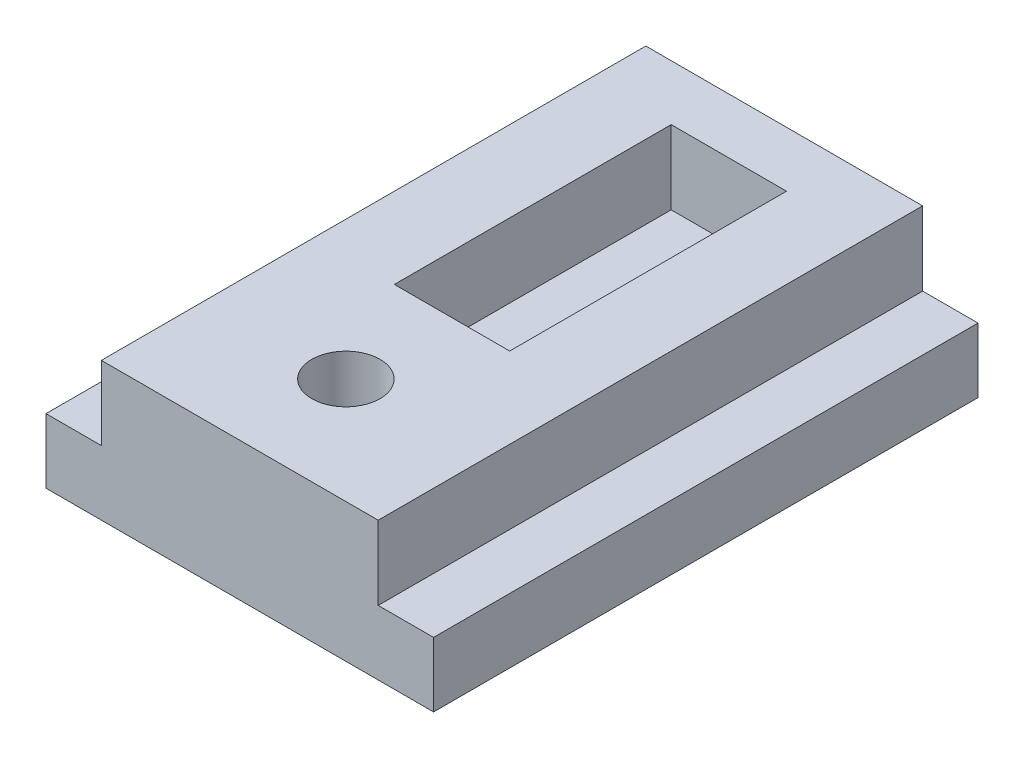
ISO-10303-21;
HEADER;
FILE_DESCRIPTION(('STEP AP214'),'2;1');
FILE_NAME('part.step','',(''),(''),'','','');
FILE_SCHEMA(('AUTOMOTIVE_DESIGN { 1 0 10303 214 1 1 1 1 }'));
ENDSEC;
DATA;
#1=APPLICATION_CONTEXT('core data for automotive mechanical design processes');
#2=APPLICATION_PROTOCOL_DEFINITION('international standard','automotive_design',2000,#1);
#3=PRODUCT_CONTEXT('',#1,'mechanical');
#4=PRODUCT('Part','Part','',(#3));
#5=PRODUCT_RELATED_PRODUCT_CATEGORY('part','',(#4));
#6=PRODUCT_DEFINITION_FORMATION('','',#4);
#7=PRODUCT_DEFINITION_CONTEXT('part definition',#1,'design');
#8=PRODUCT_DEFINITION('design','',#6,#7);
#9=PRODUCT_DEFINITION_SHAPE('','',#8);
#10=(LENGTH_UNIT() NAMED_UNIT(*) SI_UNIT(.MILLI.,.METRE.));
#11=(NAMED_UNIT(*) PLANE_ANGLE_UNIT() SI_UNIT($,.RADIAN.));
#12=(NAMED_UNIT(*) SI_UNIT($,.STERADIAN.) SOLID_ANGLE_UNIT());
#13=UNCERTAINTY_MEASURE_WITH_UNIT(LENGTH_MEASURE(1.E-05),#10,'distance_accuracy_value','');
#14=(GEOMETRIC_REPRESENTATION_CONTEXT(3) GLOBAL_UNCERTAINTY_ASSIGNED_CONTEXT((#13)) GLOBAL_UNIT_ASSIGNED_CONTEXT((#10,
#11,#12)) REPRESENTATION_CONTEXT('',''));
#15=CARTESIAN_POINT('',(0.,0.,0.));
#16=DIRECTION('',(0.,0.,1.));
#17=DIRECTION('',(1.,0.,0.));
#18=AXIS2_PLACEMENT_3D('',#15,#16,#17);
#19=CARTESIAN_POINT('',(7.5,-0.249999999999998,14.75));
#20=DIRECTION('',(-1.,0.,0.));
#21=DIRECTION('',(0.,-1.,0.));
#22=AXIS2_PLACEMENT_3D('',#19,#20,#21);
#23=PLANE('',#22);
#24=DIRECTION('',(0.,1.,0.));
#25=VECTOR('',#24,1.);
#26=CARTESIAN_POINT('',(7.5,-0.249999999999998,-14.75));
#27=LINE('',#26,#25);
#28=CARTESIAN_POINT('',(7.5,-0.249999999999998,-14.75));
#29=VERTEX_POINT('',#28);
#30=CARTESIAN_POINT('',(7.5,3.75,-14.75));
#31=VERTEX_POINT('',#30);
#32=EDGE_CURVE('E144',#29,#31,#27,.T.);
#33=ORIENTED_EDGE('',*,*,#32,.T.);
#34=DIRECTION('',(0.,0.,-1.));
#35=VECTOR('',#34,1.);
#36=CARTESIAN_POINT('',(7.5,3.75,14.75));
#37=LINE('',#36,#35);
#38=CARTESIAN_POINT('',(7.5,3.75,14.75));
#39=VERTEX_POINT('',#38);
#40=EDGE_CURVE('E11',#39,#31,#37,.T.);
#41=ORIENTED_EDGE('',*,*,#40,.F.);
#42=DIRECTION('',(0.,1.,0.));
#43=VECTOR('',#42,1.);
#44=CARTESIAN_POINT('',(7.5,-0.249999999999998,14.75));
#45=LINE('',#44,#43);
#46=CARTESIAN_POINT('',(7.5,-0.249999999999998,14.75));
#47=VERTEX_POINT('',#46);
#48=EDGE_CURVE('E160',#47,#39,#45,.T.);
#49=ORIENTED_EDGE('',*,*,#48,.F.);
#50=DIRECTION('',(0.,0.,-1.));
#51=VECTOR('',#50,1.);
#52=CARTESIAN_POINT('',(7.5,-0.249999999999998,14.75));
#53=LINE('',#52,#51);
#54=EDGE_CURVE('E140',#47,#29,#53,.T.);
#55=ORIENTED_EDGE('',*,*,#54,.T.);
#56=EDGE_LOOP('',(#33,#41,#49,#55));
#57=FACE_BOUND('',#56,.T.);
#58=ADVANCED_FACE('F36',(#57),#23,.F.);
#59=CARTESIAN_POINT('',(-7.5,3.75,14.75));
#60=DIRECTION('',(0.,-1.,0.));
#61=DIRECTION('',(1.,0.,0.));
#62=AXIS2_PLACEMENT_3D('',#59,#60,#61);
#63=PLANE('',#62);
#64=CARTESIAN_POINT('',(0.,3.75,9.));
#65=DIRECTION('',(0.,1.,0.));
#66=DIRECTION('',(0.,0.,1.));
#67=AXIS2_PLACEMENT_3D('',#64,#65,#66);
#68=CIRCLE('',#67,1.85);
#69=CARTESIAN_POINT('',(0.,3.75,10.85));
#70=VERTEX_POINT('',#69);
#71=EDGE_CURVE('E228',#70,#70,#68,.T.);
#72=ORIENTED_EDGE('',*,*,#71,.F.);
#73=EDGE_LOOP('',(#72));
#74=FACE_BOUND('',#73,.T.);
#75=DIRECTION('',(0.,0.,-1.));
#76=VECTOR('',#75,1.);
#77=CARTESIAN_POINT('',(3.125,3.75,3.25));
#78=LINE('',#77,#76);
#79=CARTESIAN_POINT('',(3.125,3.75,3.25));
#80=VERTEX_POINT('',#79);
#81=CARTESIAN_POINT('',(3.125,3.75,-11.75));
#82=VERTEX_POINT('',#81);
#83=EDGE_CURVE('E148',#80,#82,#78,.T.);
#84=ORIENTED_EDGE('',*,*,#83,.F.);
#85=DIRECTION('',(1.,0.,0.));
#86=VECTOR('',#85,1.);
#87=CARTESIAN_POINT('',(3.125,3.75,3.25));
#88=LINE('',#87,#86);
#89=CARTESIAN_POINT('',(-3.125,3.75,3.25));
#90=VERTEX_POINT('',#89);
#91=EDGE_CURVE('E197',#90,#80,#88,.T.);
#92=ORIENTED_EDGE('',*,*,#91,.F.);
#93=DIRECTION('',(0.,0.,-1.));
#94=VECTOR('',#93,1.);
#95=CARTESIAN_POINT('',(-3.125,3.75,3.25));
#96=LINE('',#95,#94);
#97=CARTESIAN_POINT('',(-3.125,3.75,-11.75));
#98=VERTEX_POINT('',#97);
#99=EDGE_CURVE('E200',#90,#98,#96,.T.);
#100=ORIENTED_EDGE('',*,*,#99,.T.);
#101=DIRECTION('',(1.,0.,0.));
#102=VECTOR('',#101,1.);
#103=CARTESIAN_POINT('',(3.125,3.75,-11.75));
#104=LINE('',#103,#102);
#105=EDGE_CURVE('E204',#98,#82,#104,.T.);
#106=ORIENTED_EDGE('',*,*,#105,.T.);
#107=EDGE_LOOP('',(#84,#92,#100,#106));
#108=FACE_BOUND('',#107,.T.);
#109=DIRECTION('',(-1.,0.,0.));
#110=VECTOR('',#109,1.);
#111=CARTESIAN_POINT('',(-7.5,3.75,-14.75));
#112=LINE('',#111,#110);
#113=CARTESIAN_POINT('',(-7.5,3.75,-14.75));
#114=VERTEX_POINT('',#113);
#115=EDGE_CURVE('E147',#31,#114,#112,.T.);
#116=ORIENTED_EDGE('',*,*,#115,.T.);
#117=DIRECTION('',(0.,0.,-1.));
#118=VECTOR('',#117,1.);
#119=CARTESIAN_POINT('',(-7.5,3.75,14.75));
#120=LINE('',#119,#118);
#121=CARTESIAN_POINT('',(-7.5,3.75,14.75));
#122=VERTEX_POINT('',#121);
#123=EDGE_CURVE('E43',#122,#114,#120,.T.);
#124=ORIENTED_EDGE('',*,*,#123,.F.);
#125=DIRECTION('',(-1.,0.,0.));
#126=VECTOR('',#125,1.);
#127=CARTESIAN_POINT('',(-7.5,3.75,14.75));
#128=LINE('',#127,#126);
#129=EDGE_CURVE('E100',#39,#122,#128,.T.);
#130=ORIENTED_EDGE('',*,*,#129,.F.);
#131=ORIENTED_EDGE('',*,*,#40,.T.);
#132=EDGE_LOOP('',(#116,#124,#130,#131));
#133=FACE_BOUND('',#132,.T.);
#134=ADVANCED_FACE('F234',(#74,#108,#133),#63,.F.);
#135=CARTESIAN_POINT('',(-7.5,-0.249999999999999,14.75));
#136=DIRECTION('',(1.,0.,0.));
#137=DIRECTION('',(0.,1.,0.));
#138=AXIS2_PLACEMENT_3D('',#135,#136,#137);
#139=PLANE('',#138);
#140=DIRECTION('',(0.,-1.,0.));
#141=VECTOR('',#140,1.);
#142=CARTESIAN_POINT('',(-7.5,-0.249999999999999,-14.75));
#143=LINE('',#142,#141);
#144=CARTESIAN_POINT('',(-7.5,-0.249999999999999,-14.75));
#145=VERTEX_POINT('',#144);
#146=EDGE_CURVE('E150',#114,#145,#143,.T.);
#147=ORIENTED_EDGE('',*,*,#146,.T.);
#148=DIRECTION('',(0.,0.,-1.));
#149=VECTOR('',#148,1.);
#150=CARTESIAN_POINT('',(-7.5,-0.249999999999999,14.75));
#151=LINE('',#150,#149);
#152=CARTESIAN_POINT('',(-7.5,-0.249999999999999,14.75));
#153=VERTEX_POINT('',#152);
#154=EDGE_CURVE('E167',#153,#145,#151,.T.);
#155=ORIENTED_EDGE('',*,*,#154,.F.);
#156=DIRECTION('',(0.,-1.,0.));
#157=VECTOR('',#156,1.);
#158=CARTESIAN_POINT('',(-7.5,-0.249999999999999,14.75));
#159=LINE('',#158,#157);
#160=EDGE_CURVE('E175',#122,#153,#159,.T.);
#161=ORIENTED_EDGE('',*,*,#160,.F.);
#162=ORIENTED_EDGE('',*,*,#123,.T.);
#163=EDGE_LOOP('',(#147,#155,#161,#162));
#164=FACE_BOUND('',#163,.T.);
#165=ADVANCED_FACE('F173',(#164),#139,.F.);
#166=CARTESIAN_POINT('',(-7.5,-0.249999999999999,14.75));
#167=DIRECTION('',(0.,-1.,0.));
#168=DIRECTION('',(1.,0.,0.));
#169=AXIS2_PLACEMENT_3D('',#166,#167,#168);
#170=PLANE('',#169);
#171=DIRECTION('',(-1.,0.,0.));
#172=VECTOR('',#171,1.);
#173=CARTESIAN_POINT('',(-7.5,-0.249999999999999,-14.75));
#174=LINE('',#173,#172);
#175=CARTESIAN_POINT('',(-10.5,-0.25,-14.75));
#176=VERTEX_POINT('',#175);
#177=EDGE_CURVE('E152',#145,#176,#174,.T.);
#178=ORIENTED_EDGE('',*,*,#177,.T.);
#179=DIRECTION('',(0.,0.,-1.));
#180=VECTOR('',#179,1.);
#181=CARTESIAN_POINT('',(-10.5,-0.25,14.75));
#182=LINE('',#181,#180);
#183=CARTESIAN_POINT('',(-10.5,-0.25,14.75));
#184=VERTEX_POINT('',#183);
#185=EDGE_CURVE('E164',#184,#176,#182,.T.);
#186=ORIENTED_EDGE('',*,*,#185,.F.);
#187=DIRECTION('',(-1.,0.,0.));
#188=VECTOR('',#187,1.);
#189=CARTESIAN_POINT('',(-7.5,-0.249999999999999,14.75));
#190=LINE('',#189,#188);
#191=EDGE_CURVE('E187',#153,#184,#190,.T.);
#192=ORIENTED_EDGE('',*,*,#191,.F.);
#193=ORIENTED_EDGE('',*,*,#154,.T.);
#194=EDGE_LOOP('',(#178,#186,#192,#193));
#195=FACE_BOUND('',#194,.T.);
#196=ADVANCED_FACE('F183',(#195),#170,.F.);
#197=CARTESIAN_POINT('',(-10.5,-3.75,14.75));
#198=DIRECTION('',(1.,0.,0.));
#199=DIRECTION('',(0.,1.,0.));
#200=AXIS2_PLACEMENT_3D('',#197,#198,#199);
#201=PLANE('',#200);
#202=DIRECTION('',(0.,-1.,0.));
#203=VECTOR('',#202,1.);
#204=CARTESIAN_POINT('',(-10.5,-3.75,-14.75));
#205=LINE('',#204,#203);
#206=CARTESIAN_POINT('',(-10.5,-3.75,-14.75));
#207=VERTEX_POINT('',#206);
#208=EDGE_CURVE('E154',#176,#207,#205,.T.);
#209=ORIENTED_EDGE('',*,*,#208,.T.);
#210=DIRECTION('',(0.,0.,-1.));
#211=VECTOR('',#210,1.);
#212=CARTESIAN_POINT('',(-10.5,-3.75,14.75));
#213=LINE('',#212,#211);
#214=CARTESIAN_POINT('',(-10.5,-3.75,14.75));
#215=VERTEX_POINT('',#214);
#216=EDGE_CURVE('E135',#215,#207,#213,.T.);
#217=ORIENTED_EDGE('',*,*,#216,.F.);
#218=DIRECTION('',(0.,-1.,0.));
#219=VECTOR('',#218,1.);
#220=CARTESIAN_POINT('',(-10.5,-3.75,14.75));
#221=LINE('',#220,#219);
#222=EDGE_CURVE('E123',#184,#215,#221,.T.);
#223=ORIENTED_EDGE('',*,*,#222,.F.);
#224=ORIENTED_EDGE('',*,*,#185,.T.);
#225=EDGE_LOOP('',(#209,#217,#223,#224));
#226=FACE_BOUND('',#225,.T.);
#227=ADVANCED_FACE('F186',(#226),#201,.F.);
#228=CARTESIAN_POINT('',(-10.5,-3.75,14.75));
#229=DIRECTION('',(0.,1.,0.));
#230=DIRECTION('',(-1.,0.,0.));
#231=AXIS2_PLACEMENT_3D('',#228,#229,#230);
#232=PLANE('',#231);
#233=CARTESIAN_POINT('',(0.,-3.75,9.));
#234=DIRECTION('',(0.,1.,0.));
#235=DIRECTION('',(-1.,0.,0.));
#236=AXIS2_PLACEMENT_3D('',#233,#234,#235);
#237=CIRCLE('',#236,1.85);
#238=CARTESIAN_POINT('',(-1.85,-3.75,9.));
#239=VERTEX_POINT('',#238);
#240=EDGE_CURVE('E215',#239,#239,#237,.T.);
#241=ORIENTED_EDGE('',*,*,#240,.T.);
#242=EDGE_LOOP('',(#241));
#243=FACE_BOUND('',#242,.T.);
#244=DIRECTION('',(1.,0.,0.));
#245=VECTOR('',#244,1.);
#246=CARTESIAN_POINT('',(-10.5,-3.75,-14.75));
#247=LINE('',#246,#245);
#248=CARTESIAN_POINT('',(10.5,-3.75,-14.75));
#249=VERTEX_POINT('',#248);
#250=EDGE_CURVE('E132',#207,#249,#247,.T.);
#251=ORIENTED_EDGE('',*,*,#250,.T.);
#252=DIRECTION('',(0.,0.,-1.));
#253=VECTOR('',#252,1.);
#254=CARTESIAN_POINT('',(10.5,-3.75,14.75));
#255=LINE('',#254,#253);
#256=CARTESIAN_POINT('',(10.5,-3.75,14.75));
#257=VERTEX_POINT('',#256);
#258=EDGE_CURVE('E129',#257,#249,#255,.T.);
#259=ORIENTED_EDGE('',*,*,#258,.F.);
#260=DIRECTION('',(1.,0.,0.));
#261=VECTOR('',#260,1.);
#262=CARTESIAN_POINT('',(-10.5,-3.75,14.75));
#263=LINE('',#262,#261);
#264=EDGE_CURVE('E116',#215,#257,#263,.T.);
#265=ORIENTED_EDGE('',*,*,#264,.F.);
#266=ORIENTED_EDGE('',*,*,#216,.T.);
#267=EDGE_LOOP('',(#251,#259,#265,#266));
#268=FACE_BOUND('',#267,.T.);
#269=ADVANCED_FACE('F130',(#243,#268),#232,.F.);
#270=CARTESIAN_POINT('',(10.5,-3.75,14.75));
#271=DIRECTION('',(-1.,0.,0.));
#272=DIRECTION('',(0.,-1.,0.));
#273=AXIS2_PLACEMENT_3D('',#270,#271,#272);
#274=PLANE('',#273);
#275=DIRECTION('',(0.,1.,0.));
#276=VECTOR('',#275,1.);
#277=CARTESIAN_POINT('',(10.5,-3.75,-14.75));
#278=LINE('',#277,#276);
#279=CARTESIAN_POINT('',(10.5,-0.249999999999997,-14.75));
#280=VERTEX_POINT('',#279);
#281=EDGE_CURVE('E157',#249,#280,#278,.T.);
#282=ORIENTED_EDGE('',*,*,#281,.T.);
#283=DIRECTION('',(0.,0.,-1.));
#284=VECTOR('',#283,1.);
#285=CARTESIAN_POINT('',(10.5,-0.249999999999997,14.75));
#286=LINE('',#285,#284);
#287=CARTESIAN_POINT('',(10.5,-0.249999999999997,14.75));
#288=VERTEX_POINT('',#287);
#289=EDGE_CURVE('E136',#288,#280,#286,.T.);
#290=ORIENTED_EDGE('',*,*,#289,.F.);
#291=DIRECTION('',(0.,1.,0.));
#292=VECTOR('',#291,1.);
#293=CARTESIAN_POINT('',(10.5,-3.75,14.75));
#294=LINE('',#293,#292);
#295=EDGE_CURVE('E120',#257,#288,#294,.T.);
#296=ORIENTED_EDGE('',*,*,#295,.F.);
#297=ORIENTED_EDGE('',*,*,#258,.T.);
#298=EDGE_LOOP('',(#282,#290,#296,#297));
#299=FACE_BOUND('',#298,.T.);
#300=ADVANCED_FACE('F138',(#299),#274,.F.);
#301=CARTESIAN_POINT('',(7.5,-0.249999999999998,14.75));
#302=DIRECTION('',(0.,-1.,0.));
#303=DIRECTION('',(1.,0.,0.));
#304=AXIS2_PLACEMENT_3D('',#301,#302,#303);
#305=PLANE('',#304);
#306=DIRECTION('',(-1.,0.,0.));
#307=VECTOR('',#306,1.);
#308=CARTESIAN_POINT('',(7.5,-0.249999999999998,-14.75));
#309=LINE('',#308,#307);
#310=EDGE_CURVE('E92',#280,#29,#309,.T.);
#311=ORIENTED_EDGE('',*,*,#310,.T.);
#312=ORIENTED_EDGE('',*,*,#54,.F.);
#313=DIRECTION('',(-1.,0.,0.));
#314=VECTOR('',#313,1.);
#315=CARTESIAN_POINT('',(7.5,-0.249999999999998,14.75));
#316=LINE('',#315,#314);
#317=EDGE_CURVE('E59',#288,#47,#316,.T.);
#318=ORIENTED_EDGE('',*,*,#317,.F.);
#319=ORIENTED_EDGE('',*,*,#289,.T.);
#320=EDGE_LOOP('',(#311,#312,#318,#319));
#321=FACE_BOUND('',#320,.T.);
#322=ADVANCED_FACE('F242',(#321),#305,.F.);
#323=CARTESIAN_POINT('',(0.,0.,14.75));
#324=DIRECTION('',(0.,0.,-1.));
#325=DIRECTION('',(-1.,0.,0.));
#326=AXIS2_PLACEMENT_3D('',#323,#324,#325);
#327=PLANE('',#326);
#328=ORIENTED_EDGE('',*,*,#48,.T.);
#329=ORIENTED_EDGE('',*,*,#129,.T.);
#330=ORIENTED_EDGE('',*,*,#160,.T.);
#331=ORIENTED_EDGE('',*,*,#191,.T.);
#332=ORIENTED_EDGE('',*,*,#222,.T.);
#333=ORIENTED_EDGE('',*,*,#264,.T.);
#334=ORIENTED_EDGE('',*,*,#295,.T.);
#335=ORIENTED_EDGE('',*,*,#317,.T.);
#336=EDGE_LOOP('',(#328,#329,#330,#331,#332,#333,#334,#335));
#337=FACE_BOUND('',#336,.T.);
#338=ADVANCED_FACE('F118',(#337),#327,.F.);
#339=CARTESIAN_POINT('',(0.,0.,-14.75));
#340=DIRECTION('',(0.,0.,-1.));
#341=DIRECTION('',(-1.,0.,0.));
#342=AXIS2_PLACEMENT_3D('',#339,#340,#341);
#343=PLANE('',#342);
#344=ORIENTED_EDGE('',*,*,#32,.F.);
#345=ORIENTED_EDGE('',*,*,#310,.F.);
#346=ORIENTED_EDGE('',*,*,#281,.F.);
#347=ORIENTED_EDGE('',*,*,#250,.F.);
#348=ORIENTED_EDGE('',*,*,#208,.F.);
#349=ORIENTED_EDGE('',*,*,#177,.F.);
#350=ORIENTED_EDGE('',*,*,#146,.F.);
#351=ORIENTED_EDGE('',*,*,#115,.F.);
#352=EDGE_LOOP('',(#344,#345,#346,#347,#348,#349,#350,#351));
#353=FACE_BOUND('',#352,.T.);
#354=ADVANCED_FACE('F179',(#353),#343,.T.);
#355=CARTESIAN_POINT('',(3.125,-0.250000000000001,3.25));
#356=DIRECTION('',(1.,0.,0.));
#357=DIRECTION('',(0.,0.,-1.));
#358=AXIS2_PLACEMENT_3D('',#355,#356,#357);
#359=PLANE('',#358);
#360=DIRECTION('',(0.,-1.,0.));
#361=VECTOR('',#360,1.);
#362=CARTESIAN_POINT('',(3.125,-0.250000000000001,-11.75));
#363=LINE('',#362,#361);
#364=CARTESIAN_POINT('',(3.125,-0.250000000000001,-11.75));
#365=VERTEX_POINT('',#364);
#366=EDGE_CURVE('E50',#82,#365,#363,.T.);
#367=ORIENTED_EDGE('',*,*,#366,.T.);
#368=DIRECTION('',(0.,0.,-1.));
#369=VECTOR('',#368,1.);
#370=CARTESIAN_POINT('',(3.125,-0.250000000000001,3.25));
#371=LINE('',#370,#369);
#372=CARTESIAN_POINT('',(3.125,-0.250000000000001,3.25));
#373=VERTEX_POINT('',#372);
#374=EDGE_CURVE('E193',#373,#365,#371,.T.);
#375=ORIENTED_EDGE('',*,*,#374,.F.);
#376=DIRECTION('',(0.,-1.,0.));
#377=VECTOR('',#376,1.);
#378=CARTESIAN_POINT('',(3.125,-0.250000000000001,3.25));
#379=LINE('',#378,#377);
#380=EDGE_CURVE('E207',#80,#373,#379,.T.);
#381=ORIENTED_EDGE('',*,*,#380,.F.);
#382=ORIENTED_EDGE('',*,*,#83,.T.);
#383=EDGE_LOOP('',(#367,#375,#381,#382));
#384=FACE_BOUND('',#383,.T.);
#385=ADVANCED_FACE('F309',(#384),#359,.F.);
#386=CARTESIAN_POINT('',(-3.125,-0.25,3.25));
#387=DIRECTION('',(-1.,0.,0.));
#388=DIRECTION('',(0.,-1.,0.));
#389=AXIS2_PLACEMENT_3D('',#386,#387,#388);
#390=PLANE('',#389);
#391=DIRECTION('',(0.,1.,0.));
#392=VECTOR('',#391,1.);
#393=CARTESIAN_POINT('',(-3.125,-0.25,-11.75));
#394=LINE('',#393,#392);
#395=CARTESIAN_POINT('',(-3.125,-0.25,-11.75));
#396=VERTEX_POINT('',#395);
#397=EDGE_CURVE('E208',#396,#98,#394,.T.);
#398=ORIENTED_EDGE('',*,*,#397,.T.);
#399=ORIENTED_EDGE('',*,*,#99,.F.);
#400=DIRECTION('',(0.,1.,0.));
#401=VECTOR('',#400,1.);
#402=CARTESIAN_POINT('',(-3.125,-0.25,3.25));
#403=LINE('',#402,#401);
#404=CARTESIAN_POINT('',(-3.125,-0.25,3.25));
#405=VERTEX_POINT('',#404);
#406=EDGE_CURVE('E218',#405,#90,#403,.T.);
#407=ORIENTED_EDGE('',*,*,#406,.F.);
#408=DIRECTION('',(0.,0.,-1.));
#409=VECTOR('',#408,1.);
#410=CARTESIAN_POINT('',(-3.125,-0.25,3.25));
#411=LINE('',#410,#409);
#412=EDGE_CURVE('E196',#405,#396,#411,.T.);
#413=ORIENTED_EDGE('',*,*,#412,.T.);
#414=EDGE_LOOP('',(#398,#399,#407,#413));
#415=FACE_BOUND('',#414,.T.);
#416=ADVANCED_FACE('F317',(#415),#390,.F.);
#417=CARTESIAN_POINT('',(3.125,-0.250000000000001,3.25));
#418=DIRECTION('',(0.,-1.,0.));
#419=DIRECTION('',(1.,0.,0.));
#420=AXIS2_PLACEMENT_3D('',#417,#418,#419);
#421=PLANE('',#420);
#422=DIRECTION('',(-1.,0.,0.));
#423=VECTOR('',#422,1.);
#424=CARTESIAN_POINT('',(3.125,-0.250000000000001,-11.75));
#425=LINE('',#424,#423);
#426=EDGE_CURVE('E211',#365,#396,#425,.T.);
#427=ORIENTED_EDGE('',*,*,#426,.T.);
#428=ORIENTED_EDGE('',*,*,#412,.F.);
#429=DIRECTION('',(-1.,0.,0.));
#430=VECTOR('',#429,1.);
#431=CARTESIAN_POINT('',(3.125,-0.250000000000001,3.25));
#432=LINE('',#431,#430);
#433=EDGE_CURVE('E221',#373,#405,#432,.T.);
#434=ORIENTED_EDGE('',*,*,#433,.F.);
#435=ORIENTED_EDGE('',*,*,#374,.T.);
#436=EDGE_LOOP('',(#427,#428,#434,#435));
#437=FACE_BOUND('',#436,.T.);
#438=ADVANCED_FACE('F327',(#437),#421,.F.);
#439=CARTESIAN_POINT('',(0.,0.,3.25));
#440=DIRECTION('',(0.,0.,1.));
#441=DIRECTION('',(1.,0.,0.));
#442=AXIS2_PLACEMENT_3D('',#439,#440,#441);
#443=PLANE('',#442);
#444=ORIENTED_EDGE('',*,*,#380,.T.);
#445=ORIENTED_EDGE('',*,*,#433,.T.);
#446=ORIENTED_EDGE('',*,*,#406,.T.);
#447=ORIENTED_EDGE('',*,*,#91,.T.);
#448=EDGE_LOOP('',(#444,#445,#446,#447));
#449=FACE_BOUND('',#448,.T.);
#450=ADVANCED_FACE('F337',(#449),#443,.F.);
#451=CARTESIAN_POINT('',(0.,0.,-11.75));
#452=DIRECTION('',(0.,0.,1.));
#453=DIRECTION('',(1.,0.,0.));
#454=AXIS2_PLACEMENT_3D('',#451,#452,#453);
#455=PLANE('',#454);
#456=ORIENTED_EDGE('',*,*,#366,.F.);
#457=ORIENTED_EDGE('',*,*,#105,.F.);
#458=ORIENTED_EDGE('',*,*,#397,.F.);
#459=ORIENTED_EDGE('',*,*,#426,.F.);
#460=EDGE_LOOP('',(#456,#457,#458,#459));
#461=FACE_BOUND('',#460,.T.);
#462=ADVANCED_FACE('F346',(#461),#455,.T.);
#463=CARTESIAN_POINT('',(0.,3.75,9.));
#464=DIRECTION('',(0.,1.,0.));
#465=DIRECTION('',(0.,0.,1.));
#466=AXIS2_PLACEMENT_3D('',#463,#464,#465);
#467=CYLINDRICAL_SURFACE('',#466,1.85);
#468=ORIENTED_EDGE('',*,*,#240,.F.);
#469=EDGE_LOOP('',(#468));
#470=FACE_BOUND('',#469,.T.);
#471=ORIENTED_EDGE('',*,*,#71,.T.);
#472=EDGE_LOOP('',(#471));
#473=FACE_BOUND('',#472,.T.);
#474=ADVANCED_FACE('F232',(#470,#473),#467,.F.);
#475=CLOSED_SHELL('',(#58,#134,#165,#196,#227,#269,#300,#322,#338,#354,#385,#416,#438,#450,#462,#474));
#476=MANIFOLD_SOLID_BREP('B2',#475);
#477=ADVANCED_BREP_SHAPE_REPRESENTATION('',(#18,#476),#14);
#478=SHAPE_DEFINITION_REPRESENTATION(#9,#477);
ENDSEC;
END-ISO-10303-21;
